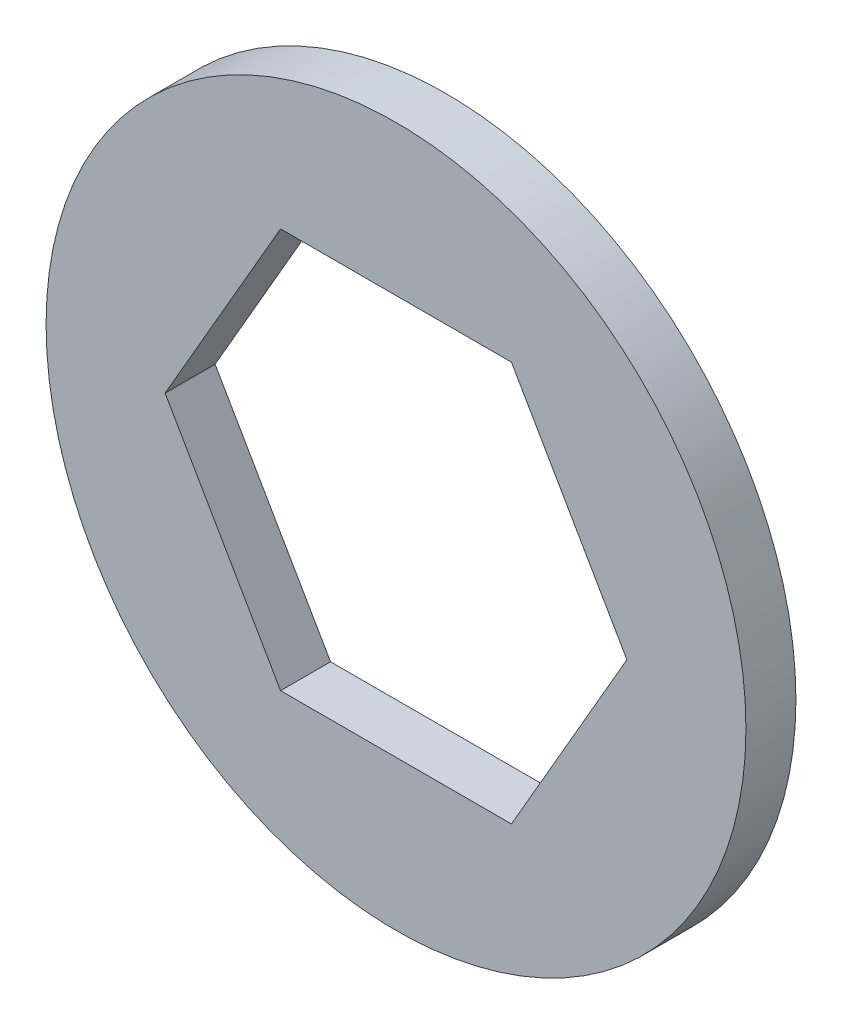
ISO-10303-21;
HEADER;
FILE_DESCRIPTION(('STEP AP214'),'2;1');
FILE_NAME('part.step','',(''),(''),'','','');
FILE_SCHEMA(('AUTOMOTIVE_DESIGN { 1 0 10303 214 1 1 1 1 }'));
ENDSEC;
DATA;
#1=APPLICATION_CONTEXT('core data for automotive mechanical design processes');
#2=APPLICATION_PROTOCOL_DEFINITION('international standard','automotive_design',2000,#1);
#3=PRODUCT_CONTEXT('',#1,'mechanical');
#4=PRODUCT('Part','Part','',(#3));
#5=PRODUCT_RELATED_PRODUCT_CATEGORY('part','',(#4));
#6=PRODUCT_DEFINITION_FORMATION('','',#4);
#7=PRODUCT_DEFINITION_CONTEXT('part definition',#1,'design');
#8=PRODUCT_DEFINITION('design','',#6,#7);
#9=PRODUCT_DEFINITION_SHAPE('','',#8);
#10=(LENGTH_UNIT() NAMED_UNIT(*) SI_UNIT(.MILLI.,.METRE.));
#11=(NAMED_UNIT(*) PLANE_ANGLE_UNIT() SI_UNIT($,.RADIAN.));
#12=(NAMED_UNIT(*) SI_UNIT($,.STERADIAN.) SOLID_ANGLE_UNIT());
#13=UNCERTAINTY_MEASURE_WITH_UNIT(LENGTH_MEASURE(1.E-05),#10,'distance_accuracy_value','');
#14=(GEOMETRIC_REPRESENTATION_CONTEXT(3) GLOBAL_UNCERTAINTY_ASSIGNED_CONTEXT((#13)) GLOBAL_UNIT_ASSIGNED_CONTEXT((#10,
#11,#12)) REPRESENTATION_CONTEXT('',''));
#15=CARTESIAN_POINT('',(0.,0.,0.));
#16=DIRECTION('',(0.,0.,1.));
#17=DIRECTION('',(1.,0.,0.));
#18=AXIS2_PLACEMENT_3D('',#15,#16,#17);
#19=CARTESIAN_POINT('',(0.,0.,1.5875));
#20=DIRECTION('',(0.,0.,1.));
#21=DIRECTION('',(1.,0.,0.));
#22=AXIS2_PLACEMENT_3D('',#19,#20,#21);
#23=PLANE('',#22);
#24=CARTESIAN_POINT('',(0.,0.,1.5875));
#25=DIRECTION('',(0.,0.,1.));
#26=DIRECTION('',(1.,0.,0.));
#27=AXIS2_PLACEMENT_3D('',#24,#25,#26);
#28=CIRCLE('',#27,11.1125);
#29=CARTESIAN_POINT('',(11.1125,0.,1.5875));
#30=VERTEX_POINT('',#29);
#31=EDGE_CURVE('E11',#30,#30,#28,.T.);
#32=ORIENTED_EDGE('',*,*,#31,.T.);
#33=EDGE_LOOP('',(#32));
#34=FACE_BOUND('',#33,.T.);
#35=DIRECTION('',(-1.,0.,0.));
#36=VECTOR('',#35,1.);
#37=CARTESIAN_POINT('',(3.66617420935412,6.35,1.5875));
#38=LINE('',#37,#36);
#39=CARTESIAN_POINT('',(3.66617420935412,6.35,1.5875));
#40=VERTEX_POINT('',#39);
#41=CARTESIAN_POINT('',(-3.66617420935412,6.35,1.5875));
#42=VERTEX_POINT('',#41);
#43=EDGE_CURVE('E100',#40,#42,#38,.T.);
#44=ORIENTED_EDGE('',*,*,#43,.F.);
#45=DIRECTION('',(-0.5,0.866025403784439,0.));
#46=VECTOR('',#45,1.);
#47=CARTESIAN_POINT('',(7.33234841870825,0.,1.5875));
#48=LINE('',#47,#46);
#49=CARTESIAN_POINT('',(7.33234841870825,0.,1.5875));
#50=VERTEX_POINT('',#49);
#51=EDGE_CURVE('E92',#50,#40,#48,.T.);
#52=ORIENTED_EDGE('',*,*,#51,.F.);
#53=DIRECTION('',(0.5,0.866025403784439,0.));
#54=VECTOR('',#53,1.);
#55=CARTESIAN_POINT('',(3.66617420935413,-6.35,1.5875));
#56=LINE('',#55,#54);
#57=CARTESIAN_POINT('',(3.66617420935412,-6.35,1.5875));
#58=VERTEX_POINT('',#57);
#59=EDGE_CURVE('E120',#58,#50,#56,.T.);
#60=ORIENTED_EDGE('',*,*,#59,.F.);
#61=DIRECTION('',(1.,0.,0.));
#62=VECTOR('',#61,1.);
#63=CARTESIAN_POINT('',(-3.66617420935412,-6.35,1.5875));
#64=LINE('',#63,#62);
#65=CARTESIAN_POINT('',(-3.66617420935412,-6.35,1.5875));
#66=VERTEX_POINT('',#65);
#67=EDGE_CURVE('E118',#66,#58,#64,.T.);
#68=ORIENTED_EDGE('',*,*,#67,.F.);
#69=DIRECTION('',(0.5,-0.866025403784439,0.));
#70=VECTOR('',#69,1.);
#71=CARTESIAN_POINT('',(-7.33234841870824,0.,1.5875));
#72=LINE('',#71,#70);
#73=CARTESIAN_POINT('',(-7.33234841870824,0.,1.5875));
#74=VERTEX_POINT('',#73);
#75=EDGE_CURVE('E114',#74,#66,#72,.T.);
#76=ORIENTED_EDGE('',*,*,#75,.F.);
#77=DIRECTION('',(-0.5,-0.866025403784439,0.));
#78=VECTOR('',#77,1.);
#79=CARTESIAN_POINT('',(-3.66617420935412,6.35,1.5875));
#80=LINE('',#79,#78);
#81=EDGE_CURVE('E112',#42,#74,#80,.T.);
#82=ORIENTED_EDGE('',*,*,#81,.F.);
#83=EDGE_LOOP('',(#44,#52,#60,#68,#76,#82));
#84=FACE_BOUND('',#83,.T.);
#85=ADVANCED_FACE('F39',(#34,#84),#23,.T.);
#86=CARTESIAN_POINT('',(0.,0.,0.));
#87=DIRECTION('',(0.,0.,1.));
#88=DIRECTION('',(1.,0.,0.));
#89=AXIS2_PLACEMENT_3D('',#86,#87,#88);
#90=PLANE('',#89);
#91=CARTESIAN_POINT('',(0.,0.,0.));
#92=DIRECTION('',(0.,0.,1.));
#93=DIRECTION('',(1.,0.,0.));
#94=AXIS2_PLACEMENT_3D('',#91,#92,#93);
#95=CIRCLE('',#94,11.1125);
#96=CARTESIAN_POINT('',(11.1125,0.,0.));
#97=VERTEX_POINT('',#96);
#98=EDGE_CURVE('E43',#97,#97,#95,.T.);
#99=ORIENTED_EDGE('',*,*,#98,.F.);
#100=EDGE_LOOP('',(#99));
#101=FACE_BOUND('',#100,.T.);
#102=DIRECTION('',(-0.5,0.866025403784439,0.));
#103=VECTOR('',#102,1.);
#104=CARTESIAN_POINT('',(7.33234841870825,0.,0.));
#105=LINE('',#104,#103);
#106=CARTESIAN_POINT('',(7.33234841870825,0.,0.));
#107=VERTEX_POINT('',#106);
#108=CARTESIAN_POINT('',(3.66617420935412,6.35,0.));
#109=VERTEX_POINT('',#108);
#110=EDGE_CURVE('E62',#107,#109,#105,.T.);
#111=ORIENTED_EDGE('',*,*,#110,.T.);
#112=DIRECTION('',(-1.,0.,0.));
#113=VECTOR('',#112,1.);
#114=CARTESIAN_POINT('',(3.66617420935412,6.35,0.));
#115=LINE('',#114,#113);
#116=CARTESIAN_POINT('',(-3.66617420935412,6.35,0.));
#117=VERTEX_POINT('',#116);
#118=EDGE_CURVE('E107',#109,#117,#115,.T.);
#119=ORIENTED_EDGE('',*,*,#118,.T.);
#120=DIRECTION('',(-0.5,-0.866025403784439,0.));
#121=VECTOR('',#120,1.);
#122=CARTESIAN_POINT('',(-3.66617420935412,6.35,0.));
#123=LINE('',#122,#121);
#124=CARTESIAN_POINT('',(-7.33234841870824,0.,0.));
#125=VERTEX_POINT('',#124);
#126=EDGE_CURVE('E124',#117,#125,#123,.T.);
#127=ORIENTED_EDGE('',*,*,#126,.T.);
#128=DIRECTION('',(0.5,-0.866025403784439,0.));
#129=VECTOR('',#128,1.);
#130=CARTESIAN_POINT('',(-7.33234841870824,0.,0.));
#131=LINE('',#130,#129);
#132=CARTESIAN_POINT('',(-3.66617420935412,-6.35,0.));
#133=VERTEX_POINT('',#132);
#134=EDGE_CURVE('E127',#125,#133,#131,.T.);
#135=ORIENTED_EDGE('',*,*,#134,.T.);
#136=DIRECTION('',(1.,0.,0.));
#137=VECTOR('',#136,1.);
#138=CARTESIAN_POINT('',(-3.66617420935412,-6.35,0.));
#139=LINE('',#138,#137);
#140=CARTESIAN_POINT('',(3.66617420935413,-6.35,0.));
#141=VERTEX_POINT('',#140);
#142=EDGE_CURVE('E130',#133,#141,#139,.T.);
#143=ORIENTED_EDGE('',*,*,#142,.T.);
#144=DIRECTION('',(0.5,0.866025403784439,0.));
#145=VECTOR('',#144,1.);
#146=CARTESIAN_POINT('',(3.66617420935413,-6.35,0.));
#147=LINE('',#146,#145);
#148=EDGE_CURVE('E101',#141,#107,#147,.T.);
#149=ORIENTED_EDGE('',*,*,#148,.T.);
#150=EDGE_LOOP('',(#111,#119,#127,#135,#143,#149));
#151=FACE_BOUND('',#150,.T.);
#152=ADVANCED_FACE('F147',(#101,#151),#90,.F.);
#153=CARTESIAN_POINT('',(0.,0.,1.5875));
#154=DIRECTION('',(0.,0.,-1.));
#155=DIRECTION('',(-1.,0.,0.));
#156=AXIS2_PLACEMENT_3D('',#153,#154,#155);
#157=CYLINDRICAL_SURFACE('',#156,11.1125);
#158=ORIENTED_EDGE('',*,*,#31,.F.);
#159=EDGE_LOOP('',(#158));
#160=FACE_BOUND('',#159,.T.);
#161=ORIENTED_EDGE('',*,*,#98,.T.);
#162=EDGE_LOOP('',(#161));
#163=FACE_BOUND('',#162,.T.);
#164=ADVANCED_FACE('F41',(#160,#163),#157,.T.);
#165=CARTESIAN_POINT('',(7.33234841870825,0.,1.5875));
#166=DIRECTION('',(-0.866025403784439,-0.5,0.));
#167=DIRECTION('',(0.5,-0.866025403784439,0.));
#168=AXIS2_PLACEMENT_3D('',#165,#166,#167);
#169=PLANE('',#168);
#170=ORIENTED_EDGE('',*,*,#110,.F.);
#171=DIRECTION('',(0.,0.,-1.));
#172=VECTOR('',#171,1.);
#173=CARTESIAN_POINT('',(7.33234841870825,0.,1.5875));
#174=LINE('',#173,#172);
#175=EDGE_CURVE('E96',#50,#107,#174,.T.);
#176=ORIENTED_EDGE('',*,*,#175,.F.);
#177=ORIENTED_EDGE('',*,*,#51,.T.);
#178=DIRECTION('',(0.,0.,-1.));
#179=VECTOR('',#178,1.);
#180=CARTESIAN_POINT('',(3.66617420935412,6.35,1.5875));
#181=LINE('',#180,#179);
#182=EDGE_CURVE('E95',#40,#109,#181,.T.);
#183=ORIENTED_EDGE('',*,*,#182,.T.);
#184=EDGE_LOOP('',(#170,#176,#177,#183));
#185=FACE_BOUND('',#184,.T.);
#186=ADVANCED_FACE('F94',(#185),#169,.T.);
#187=CARTESIAN_POINT('',(3.66617420935412,6.35,1.5875));
#188=DIRECTION('',(0.,-1.,0.));
#189=DIRECTION('',(0.,0.,-1.));
#190=AXIS2_PLACEMENT_3D('',#187,#188,#189);
#191=PLANE('',#190);
#192=ORIENTED_EDGE('',*,*,#118,.F.);
#193=ORIENTED_EDGE('',*,*,#182,.F.);
#194=ORIENTED_EDGE('',*,*,#43,.T.);
#195=DIRECTION('',(0.,0.,-1.));
#196=VECTOR('',#195,1.);
#197=CARTESIAN_POINT('',(-3.66617420935412,6.35,1.5875));
#198=LINE('',#197,#196);
#199=EDGE_CURVE('E108',#42,#117,#198,.T.);
#200=ORIENTED_EDGE('',*,*,#199,.T.);
#201=EDGE_LOOP('',(#192,#193,#194,#200));
#202=FACE_BOUND('',#201,.T.);
#203=ADVANCED_FACE('F104',(#202),#191,.T.);
#204=CARTESIAN_POINT('',(-3.66617420935412,6.35,1.5875));
#205=DIRECTION('',(0.866025403784439,-0.5,0.));
#206=DIRECTION('',(0.5,0.866025403784439,0.));
#207=AXIS2_PLACEMENT_3D('',#204,#205,#206);
#208=PLANE('',#207);
#209=ORIENTED_EDGE('',*,*,#126,.F.);
#210=ORIENTED_EDGE('',*,*,#199,.F.);
#211=ORIENTED_EDGE('',*,*,#81,.T.);
#212=DIRECTION('',(0.,0.,-1.));
#213=VECTOR('',#212,1.);
#214=CARTESIAN_POINT('',(-7.33234841870824,0.,1.5875));
#215=LINE('',#214,#213);
#216=EDGE_CURVE('E139',#74,#125,#215,.T.);
#217=ORIENTED_EDGE('',*,*,#216,.T.);
#218=EDGE_LOOP('',(#209,#210,#211,#217));
#219=FACE_BOUND('',#218,.T.);
#220=ADVANCED_FACE('F143',(#219),#208,.T.);
#221=CARTESIAN_POINT('',(-7.33234841870824,0.,1.5875));
#222=DIRECTION('',(0.866025403784439,0.5,0.));
#223=DIRECTION('',(-0.5,0.866025403784439,0.));
#224=AXIS2_PLACEMENT_3D('',#221,#222,#223);
#225=PLANE('',#224);
#226=ORIENTED_EDGE('',*,*,#134,.F.);
#227=ORIENTED_EDGE('',*,*,#216,.F.);
#228=ORIENTED_EDGE('',*,*,#75,.T.);
#229=DIRECTION('',(0.,0.,-1.));
#230=VECTOR('',#229,1.);
#231=CARTESIAN_POINT('',(-3.66617420935412,-6.35,1.5875));
#232=LINE('',#231,#230);
#233=EDGE_CURVE('E137',#66,#133,#232,.T.);
#234=ORIENTED_EDGE('',*,*,#233,.T.);
#235=EDGE_LOOP('',(#226,#227,#228,#234));
#236=FACE_BOUND('',#235,.T.);
#237=ADVANCED_FACE('F155',(#236),#225,.T.);
#238=CARTESIAN_POINT('',(-3.66617420935412,-6.35,1.5875));
#239=DIRECTION('',(0.,1.,0.));
#240=DIRECTION('',(-1.,0.,0.));
#241=AXIS2_PLACEMENT_3D('',#238,#239,#240);
#242=PLANE('',#241);
#243=ORIENTED_EDGE('',*,*,#142,.F.);
#244=ORIENTED_EDGE('',*,*,#233,.F.);
#245=ORIENTED_EDGE('',*,*,#67,.T.);
#246=DIRECTION('',(0.,0.,-1.));
#247=VECTOR('',#246,1.);
#248=CARTESIAN_POINT('',(3.66617420935413,-6.35,1.5875));
#249=LINE('',#248,#247);
#250=EDGE_CURVE('E54',#58,#141,#249,.T.);
#251=ORIENTED_EDGE('',*,*,#250,.T.);
#252=EDGE_LOOP('',(#243,#244,#245,#251));
#253=FACE_BOUND('',#252,.T.);
#254=ADVANCED_FACE('F153',(#253),#242,.T.);
#255=CARTESIAN_POINT('',(3.66617420935413,-6.35,1.5875));
#256=DIRECTION('',(-0.866025403784439,0.5,0.));
#257=DIRECTION('',(-0.5,-0.866025403784439,0.));
#258=AXIS2_PLACEMENT_3D('',#255,#256,#257);
#259=PLANE('',#258);
#260=ORIENTED_EDGE('',*,*,#148,.F.);
#261=ORIENTED_EDGE('',*,*,#250,.F.);
#262=ORIENTED_EDGE('',*,*,#59,.T.);
#263=ORIENTED_EDGE('',*,*,#175,.T.);
#264=EDGE_LOOP('',(#260,#261,#262,#263));
#265=FACE_BOUND('',#264,.T.);
#266=ADVANCED_FACE('F149',(#265),#259,.T.);
#267=CLOSED_SHELL('',(#85,#152,#164,#186,#203,#220,#237,#254,#266));
#268=MANIFOLD_SOLID_BREP('B2',#267);
#269=ADVANCED_BREP_SHAPE_REPRESENTATION('',(#18,#268),#14);
#270=SHAPE_DEFINITION_REPRESENTATION(#9,#269);
ENDSEC;
END-ISO-10303-21;
